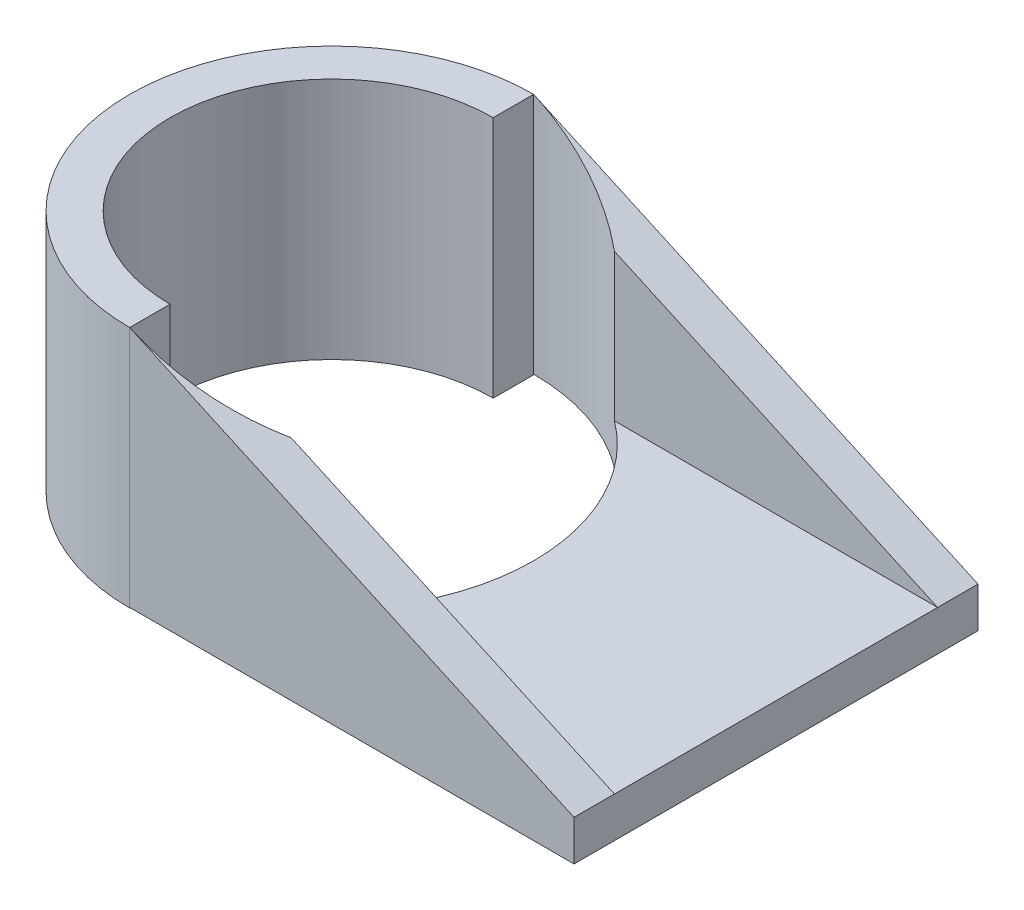
ISO-10303-21;
HEADER;
FILE_DESCRIPTION(('STEP AP214'),'2;1');
FILE_NAME('part.step','',(''),(''),'','','');
FILE_SCHEMA(('AUTOMOTIVE_DESIGN { 1 0 10303 214 1 1 1 1 }'));
ENDSEC;
DATA;
#1=APPLICATION_CONTEXT('core data for automotive mechanical design processes');
#2=APPLICATION_PROTOCOL_DEFINITION('international standard','automotive_design',2000,#1);
#3=PRODUCT_CONTEXT('',#1,'mechanical');
#4=PRODUCT('Part','Part','',(#3));
#5=PRODUCT_RELATED_PRODUCT_CATEGORY('part','',(#4));
#6=PRODUCT_DEFINITION_FORMATION('','',#4);
#7=PRODUCT_DEFINITION_CONTEXT('part definition',#1,'design');
#8=PRODUCT_DEFINITION('design','',#6,#7);
#9=PRODUCT_DEFINITION_SHAPE('','',#8);
#10=(LENGTH_UNIT() NAMED_UNIT(*) SI_UNIT(.MILLI.,.METRE.));
#11=(NAMED_UNIT(*) PLANE_ANGLE_UNIT() SI_UNIT($,.RADIAN.));
#12=(NAMED_UNIT(*) SI_UNIT($,.STERADIAN.) SOLID_ANGLE_UNIT());
#13=UNCERTAINTY_MEASURE_WITH_UNIT(LENGTH_MEASURE(1.E-05),#10,'distance_accuracy_value','');
#14=(GEOMETRIC_REPRESENTATION_CONTEXT(3) GLOBAL_UNCERTAINTY_ASSIGNED_CONTEXT((#13)) GLOBAL_UNIT_ASSIGNED_CONTEXT((#10,
#11,#12)) REPRESENTATION_CONTEXT('',''));
#15=CARTESIAN_POINT('',(0.,0.,0.));
#16=DIRECTION('',(0.,0.,1.));
#17=DIRECTION('',(1.,0.,0.));
#18=AXIS2_PLACEMENT_3D('',#15,#16,#17);
#19=CARTESIAN_POINT('',(0.,10.,0.));
#20=DIRECTION('',(0.,1.,0.));
#21=DIRECTION('',(0.,0.,1.));
#22=AXIS2_PLACEMENT_3D('',#19,#20,#21);
#23=PLANE('',#22);
#24=CARTESIAN_POINT('',(-55.,10.,0.));
#25=DIRECTION('',(0.,1.,0.));
#26=DIRECTION('',(0.,0.,1.));
#27=AXIS2_PLACEMENT_3D('',#24,#25,#26);
#28=CIRCLE('',#27,50.);
#29=CARTESIAN_POINT('',(-25.,10.,40.));
#30=VERTEX_POINT('',#29);
#31=CARTESIAN_POINT('',(-25.0000000000001,10.,-40.));
#32=VERTEX_POINT('',#31);
#33=EDGE_CURVE('E104',#30,#32,#28,.T.);
#34=ORIENTED_EDGE('',*,*,#33,.F.);
#35=DIRECTION('',(1.,0.,0.));
#36=VECTOR('',#35,1.);
#37=CARTESIAN_POINT('',(-55.,10.,40.));
#38=LINE('',#37,#36);
#39=CARTESIAN_POINT('',(55.,10.,40.));
#40=VERTEX_POINT('',#39);
#41=EDGE_CURVE('E153',#30,#40,#38,.T.);
#42=ORIENTED_EDGE('',*,*,#41,.T.);
#43=DIRECTION('',(0.,0.,-1.));
#44=VECTOR('',#43,1.);
#45=CARTESIAN_POINT('',(55.,10.,-50.));
#46=LINE('',#45,#44);
#47=CARTESIAN_POINT('',(55.,10.,-40.));
#48=VERTEX_POINT('',#47);
#49=EDGE_CURVE('E133',#40,#48,#46,.T.);
#50=ORIENTED_EDGE('',*,*,#49,.T.);
#51=DIRECTION('',(-1.,0.,0.));
#52=VECTOR('',#51,1.);
#53=CARTESIAN_POINT('',(55.,10.,-40.));
#54=LINE('',#53,#52);
#55=EDGE_CURVE('E122',#48,#32,#54,.T.);
#56=ORIENTED_EDGE('',*,*,#55,.T.);
#57=EDGE_LOOP('',(#34,#42,#50,#56));
#58=FACE_BOUND('',#57,.T.);
#59=ADVANCED_FACE('F47',(#58),#23,.T.);
#60=CARTESIAN_POINT('',(55.,10.,-50.));
#61=DIRECTION('',(-1.,0.,0.));
#62=DIRECTION('',(0.,0.,1.));
#63=AXIS2_PLACEMENT_3D('',#60,#61,#62);
#64=PLANE('',#63);
#65=DIRECTION('',(0.,0.,-1.));
#66=VECTOR('',#65,1.);
#67=CARTESIAN_POINT('',(55.,0.,-50.));
#68=LINE('',#67,#66);
#69=CARTESIAN_POINT('',(55.,0.,50.));
#70=VERTEX_POINT('',#69);
#71=CARTESIAN_POINT('',(55.,0.,-50.));
#72=VERTEX_POINT('',#71);
#73=EDGE_CURVE('E132',#70,#72,#68,.T.);
#74=ORIENTED_EDGE('',*,*,#73,.T.);
#75=DIRECTION('',(0.,-1.,0.));
#76=VECTOR('',#75,1.);
#77=CARTESIAN_POINT('',(55.,10.,-50.));
#78=LINE('',#77,#76);
#79=CARTESIAN_POINT('',(55.,10.,-50.));
#80=VERTEX_POINT('',#79);
#81=EDGE_CURVE('E146',#80,#72,#78,.T.);
#82=ORIENTED_EDGE('',*,*,#81,.F.);
#83=DIRECTION('',(0.,0.,-1.));
#84=VECTOR('',#83,1.);
#85=CARTESIAN_POINT('',(55.,10.,-40.));
#86=LINE('',#85,#84);
#87=EDGE_CURVE('E110',#48,#80,#86,.T.);
#88=ORIENTED_EDGE('',*,*,#87,.F.);
#89=ORIENTED_EDGE('',*,*,#49,.F.);
#90=CARTESIAN_POINT('',(55.,10.,50.));
#91=VERTEX_POINT('',#90);
#92=EDGE_CURVE('E135',#91,#40,#46,.T.);
#93=ORIENTED_EDGE('',*,*,#92,.F.);
#94=DIRECTION('',(0.,-1.,0.));
#95=VECTOR('',#94,1.);
#96=CARTESIAN_POINT('',(55.,10.,50.));
#97=LINE('',#96,#95);
#98=EDGE_CURVE('E172',#91,#70,#97,.T.);
#99=ORIENTED_EDGE('',*,*,#98,.T.);
#100=EDGE_LOOP('',(#74,#82,#88,#89,#93,#99));
#101=FACE_BOUND('',#100,.T.);
#102=ADVANCED_FACE('F166',(#101),#64,.F.);
#103=CARTESIAN_POINT('',(-55.,10.,-50.));
#104=DIRECTION('',(0.,0.,1.));
#105=DIRECTION('',(1.,0.,0.));
#106=AXIS2_PLACEMENT_3D('',#103,#104,#105);
#107=PLANE('',#106);
#108=DIRECTION('',(-1.,0.,0.));
#109=VECTOR('',#108,1.);
#110=CARTESIAN_POINT('',(-55.,0.,-50.));
#111=LINE('',#110,#109);
#112=CARTESIAN_POINT('',(-55.0000000000002,0.,-50.));
#113=VERTEX_POINT('',#112);
#114=EDGE_CURVE('E170',#72,#113,#111,.T.);
#115=ORIENTED_EDGE('',*,*,#114,.T.);
#116=DIRECTION('',(0.,-1.,0.));
#117=VECTOR('',#116,1.);
#118=CARTESIAN_POINT('',(-55.,10.,-50.));
#119=LINE('',#118,#117);
#120=CARTESIAN_POINT('',(-55.,60.,-50.));
#121=VERTEX_POINT('',#120);
#122=EDGE_CURVE('E12',#121,#113,#119,.T.);
#123=ORIENTED_EDGE('',*,*,#122,.F.);
#124=DIRECTION('',(0.910366477462605,-0.413802944301184,0.));
#125=VECTOR('',#124,1.);
#126=CARTESIAN_POINT('',(-55.,60.,-50.));
#127=LINE('',#126,#125);
#128=EDGE_CURVE('E119',#121,#80,#127,.T.);
#129=ORIENTED_EDGE('',*,*,#128,.T.);
#130=ORIENTED_EDGE('',*,*,#81,.T.);
#131=EDGE_LOOP('',(#115,#123,#129,#130));
#132=FACE_BOUND('',#131,.T.);
#133=ADVANCED_FACE('F169',(#132),#107,.F.);
#134=CARTESIAN_POINT('',(-55.,10.,50.));
#135=DIRECTION('',(0.,0.,-1.));
#136=DIRECTION('',(-1.,0.,0.));
#137=AXIS2_PLACEMENT_3D('',#134,#135,#136);
#138=PLANE('',#137);
#139=DIRECTION('',(1.,0.,0.));
#140=VECTOR('',#139,1.);
#141=CARTESIAN_POINT('',(-55.,0.,50.));
#142=LINE('',#141,#140);
#143=CARTESIAN_POINT('',(-55.,0.,50.));
#144=VERTEX_POINT('',#143);
#145=EDGE_CURVE('E142',#144,#70,#142,.T.);
#146=ORIENTED_EDGE('',*,*,#145,.T.);
#147=ORIENTED_EDGE('',*,*,#98,.F.);
#148=DIRECTION('',(-0.910366477462605,0.413802944301184,0.));
#149=VECTOR('',#148,1.);
#150=CARTESIAN_POINT('',(-55.,60.,50.));
#151=LINE('',#150,#149);
#152=CARTESIAN_POINT('',(-55.,60.,50.));
#153=VERTEX_POINT('',#152);
#154=EDGE_CURVE('E138',#91,#153,#151,.T.);
#155=ORIENTED_EDGE('',*,*,#154,.T.);
#156=DIRECTION('',(0.,-1.,0.));
#157=VECTOR('',#156,1.);
#158=CARTESIAN_POINT('',(-55.,10.,50.));
#159=LINE('',#158,#157);
#160=EDGE_CURVE('E136',#153,#144,#159,.T.);
#161=ORIENTED_EDGE('',*,*,#160,.T.);
#162=EDGE_LOOP('',(#146,#147,#155,#161));
#163=FACE_BOUND('',#162,.T.);
#164=ADVANCED_FACE('F178',(#163),#138,.F.);
#165=CARTESIAN_POINT('',(0.,0.,0.));
#166=DIRECTION('',(0.,1.,0.));
#167=DIRECTION('',(0.,0.,1.));
#168=AXIS2_PLACEMENT_3D('',#165,#166,#167);
#169=PLANE('',#168);
#170=ORIENTED_EDGE('',*,*,#145,.F.);
#171=CARTESIAN_POINT('',(-55.,0.,0.));
#172=DIRECTION('',(0.,1.,0.));
#173=DIRECTION('',(0.,0.,1.));
#174=AXIS2_PLACEMENT_3D('',#171,#172,#173);
#175=CIRCLE('',#174,50.);
#176=EDGE_CURVE('E61',#144,#113,#175,.T.);
#177=ORIENTED_EDGE('',*,*,#176,.T.);
#178=ORIENTED_EDGE('',*,*,#114,.F.);
#179=ORIENTED_EDGE('',*,*,#73,.F.);
#180=EDGE_LOOP('',(#170,#177,#178,#179));
#181=FACE_BOUND('',#180,.T.);
#182=ADVANCED_FACE('F177',(#181),#169,.F.);
#183=CARTESIAN_POINT('',(-55.,60.,40.));
#184=DIRECTION('',(0.413802944301184,0.910366477462605,0.));
#185=DIRECTION('',(-0.910366477462605,0.413802944301184,0.));
#186=AXIS2_PLACEMENT_3D('',#183,#184,#185);
#187=PLANE('',#186);
#188=CARTESIAN_POINT('',(-55.,60.,0.));
#189=DIRECTION('',(0.413802944301184,0.910366477462605,0.));
#190=DIRECTION('',(-0.910366477462605,0.413802944301184,0.));
#191=AXIS2_PLACEMENT_3D('',#188,#189,#190);
#192=ELLIPSE('',#191,54.9229362436117,50.);
#193=CARTESIAN_POINT('',(-25.0000000000001,46.3636363636364,40.));
#194=VERTEX_POINT('',#193);
#195=EDGE_CURVE('E109',#153,#194,#192,.T.);
#196=ORIENTED_EDGE('',*,*,#195,.F.);
#197=ORIENTED_EDGE('',*,*,#154,.F.);
#198=ORIENTED_EDGE('',*,*,#92,.T.);
#199=DIRECTION('',(-0.910366477462605,0.413802944301184,0.));
#200=VECTOR('',#199,1.);
#201=CARTESIAN_POINT('',(-55.,60.,40.));
#202=LINE('',#201,#200);
#203=EDGE_CURVE('E127',#40,#194,#202,.T.);
#204=ORIENTED_EDGE('',*,*,#203,.T.);
#205=EDGE_LOOP('',(#196,#197,#198,#204));
#206=FACE_BOUND('',#205,.T.);
#207=ADVANCED_FACE('F162',(#206),#187,.T.);
#208=CARTESIAN_POINT('',(0.,0.,40.));
#209=DIRECTION('',(0.,0.,1.));
#210=DIRECTION('',(1.,0.,0.));
#211=AXIS2_PLACEMENT_3D('',#208,#209,#210);
#212=PLANE('',#211);
#213=ORIENTED_EDGE('',*,*,#41,.F.);
#214=DIRECTION('',(0.,1.,0.));
#215=VECTOR('',#214,1.);
#216=CARTESIAN_POINT('',(-25.,-0.13648876220374,40.));
#217=LINE('',#216,#215);
#218=EDGE_CURVE('E123',#30,#194,#217,.T.);
#219=ORIENTED_EDGE('',*,*,#218,.T.);
#220=ORIENTED_EDGE('',*,*,#203,.F.);
#221=EDGE_LOOP('',(#213,#219,#220));
#222=FACE_BOUND('',#221,.T.);
#223=ADVANCED_FACE('F196',(#222),#212,.F.);
#224=CARTESIAN_POINT('',(-55.,60.,-40.));
#225=DIRECTION('',(0.413802944301184,0.910366477462605,0.));
#226=DIRECTION('',(-0.910366477462605,0.413802944301184,0.));
#227=AXIS2_PLACEMENT_3D('',#224,#225,#226);
#228=PLANE('',#227);
#229=CARTESIAN_POINT('',(-55.,60.,0.));
#230=DIRECTION('',(0.413802944301184,0.910366477462605,0.));
#231=DIRECTION('',(-0.910366477462605,0.413802944301184,0.));
#232=AXIS2_PLACEMENT_3D('',#229,#230,#231);
#233=ELLIPSE('',#232,54.9229362436117,50.);
#234=CARTESIAN_POINT('',(-25.0000000000001,46.3636363636364,-40.));
#235=VERTEX_POINT('',#234);
#236=EDGE_CURVE('E55',#235,#121,#233,.T.);
#237=ORIENTED_EDGE('',*,*,#236,.F.);
#238=DIRECTION('',(0.910366477462605,-0.413802944301184,0.));
#239=VECTOR('',#238,1.);
#240=CARTESIAN_POINT('',(-55.,60.,-40.));
#241=LINE('',#240,#239);
#242=EDGE_CURVE('E116',#235,#48,#241,.T.);
#243=ORIENTED_EDGE('',*,*,#242,.T.);
#244=ORIENTED_EDGE('',*,*,#87,.T.);
#245=ORIENTED_EDGE('',*,*,#128,.F.);
#246=EDGE_LOOP('',(#237,#243,#244,#245));
#247=FACE_BOUND('',#246,.T.);
#248=ADVANCED_FACE('F114',(#247),#228,.T.);
#249=CARTESIAN_POINT('',(0.,0.,-40.));
#250=DIRECTION('',(0.,0.,-1.));
#251=DIRECTION('',(-1.,0.,0.));
#252=AXIS2_PLACEMENT_3D('',#249,#250,#251);
#253=PLANE('',#252);
#254=ORIENTED_EDGE('',*,*,#242,.F.);
#255=DIRECTION('',(0.,1.,0.));
#256=VECTOR('',#255,1.);
#257=CARTESIAN_POINT('',(-25.,-0.13648876220374,-40.));
#258=LINE('',#257,#256);
#259=EDGE_CURVE('E101',#235,#32,#258,.F.);
#260=ORIENTED_EDGE('',*,*,#259,.T.);
#261=ORIENTED_EDGE('',*,*,#55,.F.);
#262=EDGE_LOOP('',(#254,#260,#261));
#263=FACE_BOUND('',#262,.T.);
#264=ADVANCED_FACE('F121',(#263),#253,.F.);
#265=CARTESIAN_POINT('',(-55.0000000000001,-40.,0.));
#266=DIRECTION('',(0.,1.,0.));
#267=DIRECTION('',(0.,0.,1.));
#268=AXIS2_PLACEMENT_3D('',#265,#266,#267);
#269=CYLINDRICAL_SURFACE('',#268,50.);
#270=ORIENTED_EDGE('',*,*,#160,.F.);
#271=ORIENTED_EDGE('',*,*,#195,.T.);
#272=ORIENTED_EDGE('',*,*,#218,.F.);
#273=ORIENTED_EDGE('',*,*,#33,.T.);
#274=ORIENTED_EDGE('',*,*,#259,.F.);
#275=ORIENTED_EDGE('',*,*,#236,.T.);
#276=ORIENTED_EDGE('',*,*,#122,.T.);
#277=ORIENTED_EDGE('',*,*,#176,.F.);
#278=EDGE_LOOP('',(#270,#271,#272,#273,#274,#275,#276,#277));
#279=FACE_BOUND('',#278,.T.);
#280=ADVANCED_FACE('F49',(#279),#269,.F.);
#281=CLOSED_SHELL('',(#59,#102,#133,#164,#182,#207,#223,#248,#264,#280));
#282=MANIFOLD_SOLID_BREP('B2',#281);
#283=CARTESIAN_POINT('',(-55.0000000000002,-40.,-50.));
#284=DIRECTION('',(-1.,0.,0.));
#285=DIRECTION('',(0.,0.,1.));
#286=AXIS2_PLACEMENT_3D('',#283,#284,#285);
#287=PLANE('',#286);
#288=DIRECTION('',(0.,0.,1.));
#289=VECTOR('',#288,1.);
#290=CARTESIAN_POINT('',(-55.,-0.13648876220374,0.));
#291=LINE('',#290,#289);
#292=CARTESIAN_POINT('',(-55.,-0.136488762203742,40.));
#293=VERTEX_POINT('',#292);
#294=CARTESIAN_POINT('',(-55.,-0.136488762203742,50.));
#295=VERTEX_POINT('',#294);
#296=EDGE_CURVE('E319',#293,#295,#291,.T.);
#297=ORIENTED_EDGE('',*,*,#296,.F.);
#298=DIRECTION('',(0.,1.,0.));
#299=VECTOR('',#298,1.);
#300=CARTESIAN_POINT('',(-55.,-40.,40.));
#301=LINE('',#300,#299);
#302=CARTESIAN_POINT('',(-55.,60.,40.));
#303=VERTEX_POINT('',#302);
#304=EDGE_CURVE('E45',#293,#303,#301,.T.);
#305=ORIENTED_EDGE('',*,*,#304,.T.);
#306=DIRECTION('',(0.,0.,1.));
#307=VECTOR('',#306,1.);
#308=CARTESIAN_POINT('',(-55.0000000000002,60.,-50.));
#309=LINE('',#308,#307);
#310=CARTESIAN_POINT('',(-55.,60.,50.));
#311=VERTEX_POINT('',#310);
#312=EDGE_CURVE('E317',#303,#311,#309,.T.);
#313=ORIENTED_EDGE('',*,*,#312,.T.);
#314=DIRECTION('',(0.,1.,0.));
#315=VECTOR('',#314,1.);
#316=CARTESIAN_POINT('',(-55.,-40.,50.));
#317=LINE('',#316,#315);
#318=EDGE_CURVE('E327',#295,#311,#317,.T.);
#319=ORIENTED_EDGE('',*,*,#318,.F.);
#320=EDGE_LOOP('',(#297,#305,#313,#319));
#321=FACE_BOUND('',#320,.T.);
#322=ADVANCED_FACE('F268',(#321),#287,.F.);
#323=CARTESIAN_POINT('',(-55.,-0.13648876220374,0.));
#324=DIRECTION('',(0.,1.,0.));
#325=DIRECTION('',(0.,0.,1.));
#326=AXIS2_PLACEMENT_3D('',#323,#324,#325);
#327=PLANE('',#326);
#328=CARTESIAN_POINT('',(-55.0000000000002,-0.136488762203742,-50.));
#329=VERTEX_POINT('',#328);
#330=CARTESIAN_POINT('',(-55.0000000000001,-0.13648876220374,-40.));
#331=VERTEX_POINT('',#330);
#332=EDGE_CURVE('E330',#329,#331,#291,.T.);
#333=ORIENTED_EDGE('',*,*,#332,.T.);
#334=CARTESIAN_POINT('',(-55.,-0.136488762203742,0.));
#335=DIRECTION('',(0.,1.,0.));
#336=DIRECTION('',(0.,0.,1.));
#337=AXIS2_PLACEMENT_3D('',#334,#335,#336);
#338=CIRCLE('',#337,40.);
#339=EDGE_CURVE('E283',#331,#293,#338,.T.);
#340=ORIENTED_EDGE('',*,*,#339,.T.);
#341=ORIENTED_EDGE('',*,*,#296,.T.);
#342=CARTESIAN_POINT('',(-55.,-0.13648876220374,0.));
#343=DIRECTION('',(0.,1.,0.));
#344=DIRECTION('',(0.,0.,1.));
#345=AXIS2_PLACEMENT_3D('',#342,#343,#344);
#346=CIRCLE('',#345,50.);
#347=EDGE_CURVE('E334',#329,#295,#346,.T.);
#348=ORIENTED_EDGE('',*,*,#347,.F.);
#349=EDGE_LOOP('',(#333,#340,#341,#348));
#350=FACE_BOUND('',#349,.T.);
#351=ADVANCED_FACE('F339',(#350),#327,.F.);
#352=CARTESIAN_POINT('',(-55.,60.,0.));
#353=DIRECTION('',(0.,1.,0.));
#354=DIRECTION('',(0.,0.,1.));
#355=AXIS2_PLACEMENT_3D('',#352,#353,#354);
#356=PLANE('',#355);
#357=CARTESIAN_POINT('',(-55.,60.,0.));
#358=DIRECTION('',(0.,1.,0.));
#359=DIRECTION('',(0.,0.,1.));
#360=AXIS2_PLACEMENT_3D('',#357,#358,#359);
#361=CIRCLE('',#360,40.);
#362=CARTESIAN_POINT('',(-55.,60.,-40.));
#363=VERTEX_POINT('',#362);
#364=EDGE_CURVE('E308',#363,#303,#361,.T.);
#365=ORIENTED_EDGE('',*,*,#364,.F.);
#366=CARTESIAN_POINT('',(-55.,60.,-50.));
#367=VERTEX_POINT('',#366);
#368=EDGE_CURVE('E323',#367,#363,#309,.T.);
#369=ORIENTED_EDGE('',*,*,#368,.F.);
#370=CARTESIAN_POINT('',(-55.,60.,0.));
#371=DIRECTION('',(0.,1.,0.));
#372=DIRECTION('',(0.,0.,1.));
#373=AXIS2_PLACEMENT_3D('',#370,#371,#372);
#374=CIRCLE('',#373,50.);
#375=EDGE_CURVE('E322',#367,#311,#374,.T.);
#376=ORIENTED_EDGE('',*,*,#375,.T.);
#377=ORIENTED_EDGE('',*,*,#312,.F.);
#378=EDGE_LOOP('',(#365,#369,#376,#377));
#379=FACE_BOUND('',#378,.T.);
#380=ADVANCED_FACE('F321',(#379),#356,.T.);
#381=CARTESIAN_POINT('',(-55.,-0.13648876220374,0.));
#382=DIRECTION('',(0.,1.,0.));
#383=DIRECTION('',(0.,0.,1.));
#384=AXIS2_PLACEMENT_3D('',#381,#382,#383);
#385=CYLINDRICAL_SURFACE('',#384,50.);
#386=ORIENTED_EDGE('',*,*,#318,.T.);
#387=ORIENTED_EDGE('',*,*,#375,.F.);
#388=DIRECTION('',(0.,1.,0.));
#389=VECTOR('',#388,1.);
#390=CARTESIAN_POINT('',(-55.0000000000002,-40.,-50.));
#391=LINE('',#390,#389);
#392=EDGE_CURVE('E291',#329,#367,#391,.T.);
#393=ORIENTED_EDGE('',*,*,#392,.F.);
#394=ORIENTED_EDGE('',*,*,#347,.T.);
#395=EDGE_LOOP('',(#386,#387,#393,#394));
#396=FACE_BOUND('',#395,.T.);
#397=ADVANCED_FACE('F270',(#396),#385,.T.);
#398=ORIENTED_EDGE('',*,*,#368,.T.);
#399=DIRECTION('',(0.,1.,0.));
#400=VECTOR('',#399,1.);
#401=CARTESIAN_POINT('',(-55.0000000000001,-40.,-40.));
#402=LINE('',#401,#400);
#403=EDGE_CURVE('E276',#363,#331,#402,.F.);
#404=ORIENTED_EDGE('',*,*,#403,.T.);
#405=ORIENTED_EDGE('',*,*,#332,.F.);
#406=ORIENTED_EDGE('',*,*,#392,.T.);
#407=EDGE_LOOP('',(#398,#404,#405,#406));
#408=FACE_BOUND('',#407,.T.);
#409=ADVANCED_FACE('F336',(#408),#287,.F.);
#410=CARTESIAN_POINT('',(-55.,-40.,0.));
#411=DIRECTION('',(0.,1.,0.));
#412=DIRECTION('',(0.,0.,1.));
#413=AXIS2_PLACEMENT_3D('',#410,#411,#412);
#414=CYLINDRICAL_SURFACE('',#413,40.);
#415=ORIENTED_EDGE('',*,*,#403,.F.);
#416=ORIENTED_EDGE('',*,*,#364,.T.);
#417=ORIENTED_EDGE('',*,*,#304,.F.);
#418=ORIENTED_EDGE('',*,*,#339,.F.);
#419=EDGE_LOOP('',(#415,#416,#417,#418));
#420=FACE_BOUND('',#419,.T.);
#421=ADVANCED_FACE('F309',(#420),#414,.F.);
#422=CLOSED_SHELL('',(#322,#351,#380,#397,#409,#421));
#423=MANIFOLD_SOLID_BREP('B6',#422);
#424=ADVANCED_BREP_SHAPE_REPRESENTATION('',(#18,#282,#423),#14);
#425=SHAPE_DEFINITION_REPRESENTATION(#9,#424);
ENDSEC;
END-ISO-10303-21;
